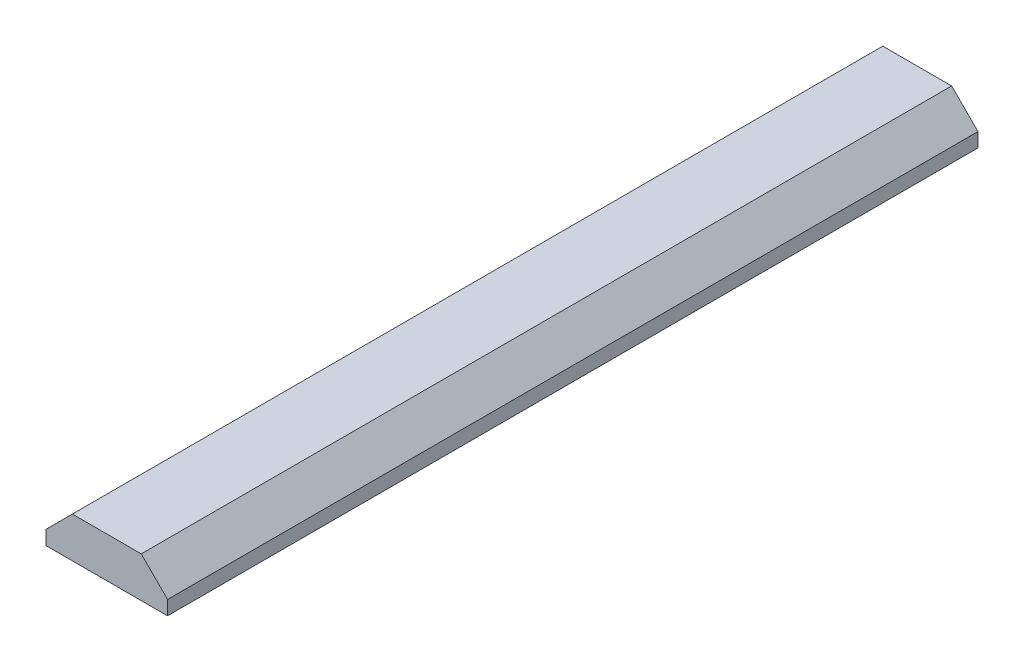
ISO-10303-21;
HEADER;
FILE_DESCRIPTION(('STEP AP214'),'2;1');
FILE_NAME('part.step','',(''),(''),'','','');
FILE_SCHEMA(('AUTOMOTIVE_DESIGN { 1 0 10303 214 1 1 1 1 }'));
ENDSEC;
DATA;
#1=APPLICATION_CONTEXT('core data for automotive mechanical design processes');
#2=APPLICATION_PROTOCOL_DEFINITION('international standard','automotive_design',2000,#1);
#3=PRODUCT_CONTEXT('',#1,'mechanical');
#4=PRODUCT('Part','Part','',(#3));
#5=PRODUCT_RELATED_PRODUCT_CATEGORY('part','',(#4));
#6=PRODUCT_DEFINITION_FORMATION('','',#4);
#7=PRODUCT_DEFINITION_CONTEXT('part definition',#1,'design');
#8=PRODUCT_DEFINITION('design','',#6,#7);
#9=PRODUCT_DEFINITION_SHAPE('','',#8);
#10=(LENGTH_UNIT() NAMED_UNIT(*) SI_UNIT(.MILLI.,.METRE.));
#11=(NAMED_UNIT(*) PLANE_ANGLE_UNIT() SI_UNIT($,.RADIAN.));
#12=(NAMED_UNIT(*) SI_UNIT($,.STERADIAN.) SOLID_ANGLE_UNIT());
#13=UNCERTAINTY_MEASURE_WITH_UNIT(LENGTH_MEASURE(1.E-05),#10,'distance_accuracy_value','');
#14=(GEOMETRIC_REPRESENTATION_CONTEXT(3) GLOBAL_UNCERTAINTY_ASSIGNED_CONTEXT((#13)) GLOBAL_UNIT_ASSIGNED_CONTEXT((#10,
#11,#12)) REPRESENTATION_CONTEXT('',''));
#15=CARTESIAN_POINT('',(0.,0.,0.));
#16=DIRECTION('',(0.,0.,1.));
#17=DIRECTION('',(1.,0.,0.));
#18=AXIS2_PLACEMENT_3D('',#15,#16,#17);
#19=CARTESIAN_POINT('',(3.4,1.80885878693797,80.));
#20=DIRECTION('',(0.707106781186549,0.707106781186546,0.));
#21=DIRECTION('',(-0.707106781186546,0.707106781186549,0.));
#22=AXIS2_PLACEMENT_3D('',#19,#20,#21);
#23=PLANE('',#22);
#24=DIRECTION('',(0.707106781186546,-0.707106781186549,0.));
#25=VECTOR('',#24,1.);
#26=CARTESIAN_POINT('',(3.4,1.80885878693797,0.));
#27=LINE('',#26,#25);
#28=CARTESIAN_POINT('',(3.4,1.80885878693797,0.));
#29=VERTEX_POINT('',#28);
#30=CARTESIAN_POINT('',(6.,-0.791141213062042,0.));
#31=VERTEX_POINT('',#30);
#32=EDGE_CURVE('E127',#29,#31,#27,.T.);
#33=ORIENTED_EDGE('',*,*,#32,.F.);
#34=DIRECTION('',(0.,0.,-1.));
#35=VECTOR('',#34,1.);
#36=CARTESIAN_POINT('',(3.4,1.80885878693797,80.));
#37=LINE('',#36,#35);
#38=CARTESIAN_POINT('',(3.4,1.80885878693797,80.));
#39=VERTEX_POINT('',#38);
#40=EDGE_CURVE('E11',#39,#29,#37,.T.);
#41=ORIENTED_EDGE('',*,*,#40,.F.);
#42=DIRECTION('',(0.707106781186546,-0.707106781186549,0.));
#43=VECTOR('',#42,1.);
#44=CARTESIAN_POINT('',(3.4,1.80885878693797,80.));
#45=LINE('',#44,#43);
#46=CARTESIAN_POINT('',(6.,-0.791141213062042,80.));
#47=VERTEX_POINT('',#46);
#48=EDGE_CURVE('E139',#39,#47,#45,.T.);
#49=ORIENTED_EDGE('',*,*,#48,.T.);
#50=DIRECTION('',(0.,0.,-1.));
#51=VECTOR('',#50,1.);
#52=CARTESIAN_POINT('',(6.,-0.791141213062042,80.));
#53=LINE('',#52,#51);
#54=EDGE_CURVE('E44',#47,#31,#53,.T.);
#55=ORIENTED_EDGE('',*,*,#54,.T.);
#56=EDGE_LOOP('',(#33,#41,#49,#55));
#57=FACE_BOUND('',#56,.T.);
#58=ADVANCED_FACE('F41',(#57),#23,.T.);
#59=CARTESIAN_POINT('',(3.4,1.80885878693797,80.));
#60=DIRECTION('',(0.,-1.,0.));
#61=DIRECTION('',(0.,0.,-1.));
#62=AXIS2_PLACEMENT_3D('',#59,#60,#61);
#63=PLANE('',#62);
#64=DIRECTION('',(-1.,0.,0.));
#65=VECTOR('',#64,1.);
#66=CARTESIAN_POINT('',(3.4,1.80885878693797,0.));
#67=LINE('',#66,#65);
#68=CARTESIAN_POINT('',(-3.4,1.80885878693797,0.));
#69=VERTEX_POINT('',#68);
#70=EDGE_CURVE('E80',#29,#69,#67,.T.);
#71=ORIENTED_EDGE('',*,*,#70,.T.);
#72=DIRECTION('',(0.,0.,-1.));
#73=VECTOR('',#72,1.);
#74=CARTESIAN_POINT('',(-3.4,1.80885878693797,80.));
#75=LINE('',#74,#73);
#76=CARTESIAN_POINT('',(-3.4,1.80885878693797,80.));
#77=VERTEX_POINT('',#76);
#78=EDGE_CURVE('E50',#77,#69,#75,.T.);
#79=ORIENTED_EDGE('',*,*,#78,.F.);
#80=DIRECTION('',(-1.,0.,0.));
#81=VECTOR('',#80,1.);
#82=CARTESIAN_POINT('',(3.4,1.80885878693797,80.));
#83=LINE('',#82,#81);
#84=EDGE_CURVE('E105',#39,#77,#83,.T.);
#85=ORIENTED_EDGE('',*,*,#84,.F.);
#86=ORIENTED_EDGE('',*,*,#40,.T.);
#87=EDGE_LOOP('',(#71,#79,#85,#86));
#88=FACE_BOUND('',#87,.T.);
#89=ADVANCED_FACE('F159',(#88),#63,.F.);
#90=CARTESIAN_POINT('',(-3.4,1.80885878693797,80.));
#91=DIRECTION('',(0.707106781186549,-0.707106781186546,0.));
#92=DIRECTION('',(0.707106781186546,0.707106781186549,0.));
#93=AXIS2_PLACEMENT_3D('',#90,#91,#92);
#94=PLANE('',#93);
#95=DIRECTION('',(-0.707106781186546,-0.707106781186549,0.));
#96=VECTOR('',#95,1.);
#97=CARTESIAN_POINT('',(-3.4,1.80885878693797,0.));
#98=LINE('',#97,#96);
#99=CARTESIAN_POINT('',(-6.,-0.791141213062042,0.));
#100=VERTEX_POINT('',#99);
#101=EDGE_CURVE('E112',#69,#100,#98,.T.);
#102=ORIENTED_EDGE('',*,*,#101,.T.);
#103=DIRECTION('',(0.,0.,-1.));
#104=VECTOR('',#103,1.);
#105=CARTESIAN_POINT('',(-6.,-0.791141213062042,80.));
#106=LINE('',#105,#104);
#107=CARTESIAN_POINT('',(-6.,-0.791141213062042,80.));
#108=VERTEX_POINT('',#107);
#109=EDGE_CURVE('E109',#108,#100,#106,.T.);
#110=ORIENTED_EDGE('',*,*,#109,.F.);
#111=DIRECTION('',(-0.707106781186546,-0.707106781186549,0.));
#112=VECTOR('',#111,1.);
#113=CARTESIAN_POINT('',(-3.4,1.80885878693797,80.));
#114=LINE('',#113,#112);
#115=EDGE_CURVE('E98',#77,#108,#114,.T.);
#116=ORIENTED_EDGE('',*,*,#115,.F.);
#117=ORIENTED_EDGE('',*,*,#78,.T.);
#118=EDGE_LOOP('',(#102,#110,#116,#117));
#119=FACE_BOUND('',#118,.T.);
#120=ADVANCED_FACE('F110',(#119),#94,.F.);
#121=CARTESIAN_POINT('',(-6.,-0.791141213062042,80.));
#122=DIRECTION('',(1.,0.,0.));
#123=DIRECTION('',(0.,0.,-1.));
#124=AXIS2_PLACEMENT_3D('',#121,#122,#123);
#125=PLANE('',#124);
#126=DIRECTION('',(0.,-1.,0.));
#127=VECTOR('',#126,1.);
#128=CARTESIAN_POINT('',(-6.,-0.791141213062042,0.));
#129=LINE('',#128,#127);
#130=CARTESIAN_POINT('',(-6.,-2.19114121306203,0.));
#131=VERTEX_POINT('',#130);
#132=EDGE_CURVE('E136',#100,#131,#129,.T.);
#133=ORIENTED_EDGE('',*,*,#132,.T.);
#134=DIRECTION('',(0.,0.,-1.));
#135=VECTOR('',#134,1.);
#136=CARTESIAN_POINT('',(-6.,-2.19114121306203,80.));
#137=LINE('',#136,#135);
#138=CARTESIAN_POINT('',(-6.,-2.19114121306203,80.));
#139=VERTEX_POINT('',#138);
#140=EDGE_CURVE('E115',#139,#131,#137,.T.);
#141=ORIENTED_EDGE('',*,*,#140,.F.);
#142=DIRECTION('',(0.,-1.,0.));
#143=VECTOR('',#142,1.);
#144=CARTESIAN_POINT('',(-6.,-0.791141213062042,80.));
#145=LINE('',#144,#143);
#146=EDGE_CURVE('E103',#108,#139,#145,.T.);
#147=ORIENTED_EDGE('',*,*,#146,.F.);
#148=ORIENTED_EDGE('',*,*,#109,.T.);
#149=EDGE_LOOP('',(#133,#141,#147,#148));
#150=FACE_BOUND('',#149,.T.);
#151=ADVANCED_FACE('F117',(#150),#125,.F.);
#152=CARTESIAN_POINT('',(-6.,-2.19114121306203,80.));
#153=DIRECTION('',(0.,1.,0.));
#154=DIRECTION('',(0.,0.,1.));
#155=AXIS2_PLACEMENT_3D('',#152,#153,#154);
#156=PLANE('',#155);
#157=DIRECTION('',(1.,0.,0.));
#158=VECTOR('',#157,1.);
#159=CARTESIAN_POINT('',(-6.,-2.19114121306203,0.));
#160=LINE('',#159,#158);
#161=CARTESIAN_POINT('',(6.,-2.19114121306203,0.));
#162=VERTEX_POINT('',#161);
#163=EDGE_CURVE('E133',#131,#162,#160,.T.);
#164=ORIENTED_EDGE('',*,*,#163,.T.);
#165=DIRECTION('',(0.,0.,-1.));
#166=VECTOR('',#165,1.);
#167=CARTESIAN_POINT('',(6.,-2.19114121306203,80.));
#168=LINE('',#167,#166);
#169=CARTESIAN_POINT('',(6.,-2.19114121306203,80.));
#170=VERTEX_POINT('',#169);
#171=EDGE_CURVE('E142',#170,#162,#168,.T.);
#172=ORIENTED_EDGE('',*,*,#171,.F.);
#173=DIRECTION('',(1.,0.,0.));
#174=VECTOR('',#173,1.);
#175=CARTESIAN_POINT('',(-6.,-2.19114121306203,80.));
#176=LINE('',#175,#174);
#177=EDGE_CURVE('E120',#139,#170,#176,.T.);
#178=ORIENTED_EDGE('',*,*,#177,.F.);
#179=ORIENTED_EDGE('',*,*,#140,.T.);
#180=EDGE_LOOP('',(#164,#172,#178,#179));
#181=FACE_BOUND('',#180,.T.);
#182=ADVANCED_FACE('F149',(#181),#156,.F.);
#183=CARTESIAN_POINT('',(6.,-0.791141213062042,80.));
#184=DIRECTION('',(1.,0.,0.));
#185=DIRECTION('',(0.,0.,-1.));
#186=AXIS2_PLACEMENT_3D('',#183,#184,#185);
#187=PLANE('',#186);
#188=DIRECTION('',(0.,-1.,0.));
#189=VECTOR('',#188,1.);
#190=CARTESIAN_POINT('',(6.,-0.791141213062042,0.));
#191=LINE('',#190,#189);
#192=EDGE_CURVE('E130',#31,#162,#191,.T.);
#193=ORIENTED_EDGE('',*,*,#192,.F.);
#194=ORIENTED_EDGE('',*,*,#54,.F.);
#195=DIRECTION('',(0.,-1.,0.));
#196=VECTOR('',#195,1.);
#197=CARTESIAN_POINT('',(6.,-0.791141213062042,80.));
#198=LINE('',#197,#196);
#199=EDGE_CURVE('E122',#47,#170,#198,.T.);
#200=ORIENTED_EDGE('',*,*,#199,.T.);
#201=ORIENTED_EDGE('',*,*,#171,.T.);
#202=EDGE_LOOP('',(#193,#194,#200,#201));
#203=FACE_BOUND('',#202,.T.);
#204=ADVANCED_FACE('F144',(#203),#187,.T.);
#205=CARTESIAN_POINT('',(0.,0.,80.));
#206=DIRECTION('',(0.,0.,-1.));
#207=DIRECTION('',(-1.,0.,0.));
#208=AXIS2_PLACEMENT_3D('',#205,#206,#207);
#209=PLANE('',#208);
#210=ORIENTED_EDGE('',*,*,#48,.F.);
#211=ORIENTED_EDGE('',*,*,#84,.T.);
#212=ORIENTED_EDGE('',*,*,#115,.T.);
#213=ORIENTED_EDGE('',*,*,#146,.T.);
#214=ORIENTED_EDGE('',*,*,#177,.T.);
#215=ORIENTED_EDGE('',*,*,#199,.F.);
#216=EDGE_LOOP('',(#210,#211,#212,#213,#214,#215));
#217=FACE_BOUND('',#216,.T.);
#218=ADVANCED_FACE('F101',(#217),#209,.F.);
#219=CARTESIAN_POINT('',(0.,0.,0.));
#220=DIRECTION('',(0.,0.,-1.));
#221=DIRECTION('',(-1.,0.,0.));
#222=AXIS2_PLACEMENT_3D('',#219,#220,#221);
#223=PLANE('',#222);
#224=ORIENTED_EDGE('',*,*,#32,.T.);
#225=ORIENTED_EDGE('',*,*,#192,.T.);
#226=ORIENTED_EDGE('',*,*,#163,.F.);
#227=ORIENTED_EDGE('',*,*,#132,.F.);
#228=ORIENTED_EDGE('',*,*,#101,.F.);
#229=ORIENTED_EDGE('',*,*,#70,.F.);
#230=EDGE_LOOP('',(#224,#225,#226,#227,#228,#229));
#231=FACE_BOUND('',#230,.T.);
#232=ADVANCED_FACE('F147',(#231),#223,.T.);
#233=CLOSED_SHELL('',(#58,#89,#120,#151,#182,#204,#218,#232));
#234=MANIFOLD_SOLID_BREP('B2',#233);
#235=ADVANCED_BREP_SHAPE_REPRESENTATION('',(#18,#234),#14);
#236=SHAPE_DEFINITION_REPRESENTATION(#9,#235);
ENDSEC;
END-ISO-10303-21;
